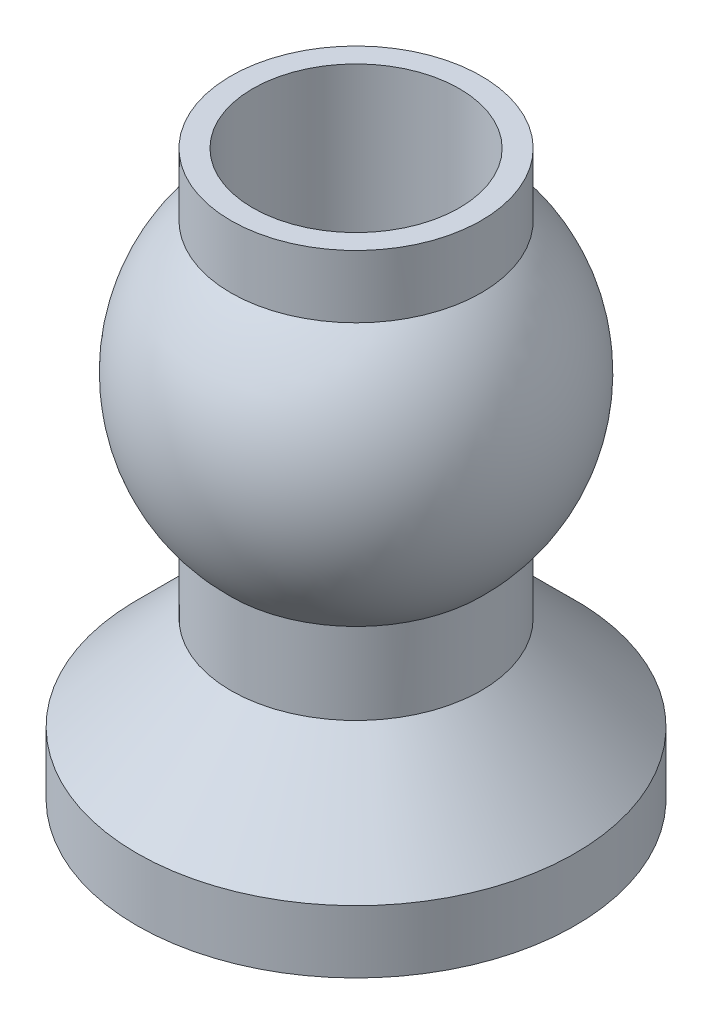
ISO-10303-21;
HEADER;
FILE_DESCRIPTION(('STEP AP214'),'2;1');
FILE_NAME('part.step','',(''),(''),'','','');
FILE_SCHEMA(('AUTOMOTIVE_DESIGN { 1 0 10303 214 1 1 1 1 }'));
ENDSEC;
DATA;
#1=APPLICATION_CONTEXT('core data for automotive mechanical design processes');
#2=APPLICATION_PROTOCOL_DEFINITION('international standard','automotive_design',2000,#1);
#3=PRODUCT_CONTEXT('',#1,'mechanical');
#4=PRODUCT('Part','Part','',(#3));
#5=PRODUCT_RELATED_PRODUCT_CATEGORY('part','',(#4));
#6=PRODUCT_DEFINITION_FORMATION('','',#4);
#7=PRODUCT_DEFINITION_CONTEXT('part definition',#1,'design');
#8=PRODUCT_DEFINITION('design','',#6,#7);
#9=PRODUCT_DEFINITION_SHAPE('','',#8);
#10=(LENGTH_UNIT() NAMED_UNIT(*) SI_UNIT(.MILLI.,.METRE.));
#11=(NAMED_UNIT(*) PLANE_ANGLE_UNIT() SI_UNIT($,.RADIAN.));
#12=(NAMED_UNIT(*) SI_UNIT($,.STERADIAN.) SOLID_ANGLE_UNIT());
#13=UNCERTAINTY_MEASURE_WITH_UNIT(LENGTH_MEASURE(1.E-05),#10,'distance_accuracy_value','');
#14=(GEOMETRIC_REPRESENTATION_CONTEXT(3) GLOBAL_UNCERTAINTY_ASSIGNED_CONTEXT((#13)) GLOBAL_UNIT_ASSIGNED_CONTEXT((#10,
#11,#12)) REPRESENTATION_CONTEXT('',''));
#15=CARTESIAN_POINT('',(0.,0.,0.));
#16=DIRECTION('',(0.,0.,1.));
#17=DIRECTION('',(1.,0.,0.));
#18=AXIS2_PLACEMENT_3D('',#15,#16,#17);
#19=CARTESIAN_POINT('',(2.,4.5,0.));
#20=DIRECTION('',(0.,-1.,0.));
#21=DIRECTION('',(0.,0.,-1.));
#22=AXIS2_PLACEMENT_3D('',#19,#20,#21);
#23=PLANE('',#22);
#24=CARTESIAN_POINT('',(0.,4.5,0.));
#25=DIRECTION('',(0.,1.,0.));
#26=DIRECTION('',(0.,0.,1.));
#27=AXIS2_PLACEMENT_3D('',#24,#25,#26);
#28=CIRCLE('',#27,1.65);
#29=CARTESIAN_POINT('',(0.,4.5,1.65));
#30=VERTEX_POINT('',#29);
#31=EDGE_CURVE('E56',#30,#30,#28,.T.);
#32=ORIENTED_EDGE('',*,*,#31,.F.);
#33=EDGE_LOOP('',(#32));
#34=FACE_BOUND('',#33,.T.);
#35=CARTESIAN_POINT('',(0.,4.5,0.));
#36=DIRECTION('',(0.,1.,0.));
#37=DIRECTION('',(0.,0.,1.));
#38=AXIS2_PLACEMENT_3D('',#35,#36,#37);
#39=CIRCLE('',#38,2.);
#40=CARTESIAN_POINT('',(0.,4.5,2.));
#41=VERTEX_POINT('',#40);
#42=EDGE_CURVE('E10',#41,#41,#39,.T.);
#43=ORIENTED_EDGE('',*,*,#42,.T.);
#44=EDGE_LOOP('',(#43));
#45=FACE_BOUND('',#44,.T.);
#46=ADVANCED_FACE('F31',(#34,#45),#23,.F.);
#47=CARTESIAN_POINT('',(0.,9.81662984616882,0.));
#48=DIRECTION('',(0.,1.,0.));
#49=DIRECTION('',(0.,0.,1.));
#50=AXIS2_PLACEMENT_3D('',#47,#48,#49);
#51=CYLINDRICAL_SURFACE('',#50,2.);
#52=ORIENTED_EDGE('',*,*,#42,.F.);
#53=EDGE_LOOP('',(#52));
#54=FACE_BOUND('',#53,.T.);
#55=CARTESIAN_POINT('',(0.,3.5,0.));
#56=DIRECTION('',(0.,1.,0.));
#57=DIRECTION('',(0.,0.,1.));
#58=AXIS2_PLACEMENT_3D('',#55,#56,#57);
#59=CIRCLE('',#58,2.);
#60=CARTESIAN_POINT('',(2.,3.5,0.));
#61=VERTEX_POINT('',#60);
#62=EDGE_CURVE('E38',#61,#61,#59,.T.);
#63=ORIENTED_EDGE('',*,*,#62,.T.);
#64=EDGE_LOOP('',(#63));
#65=FACE_BOUND('',#64,.T.);
#66=ADVANCED_FACE('F75',(#54,#65),#51,.T.);
#67=CARTESIAN_POINT('',(0.,1.4,0.));
#68=DIRECTION('',(0.,1.,0.));
#69=DIRECTION('',(1.,0.,0.));
#70=AXIS2_PLACEMENT_3D('',#67,#68,#69);
#71=SPHERICAL_SURFACE('',#70,2.9);
#72=CARTESIAN_POINT('',(0.,-0.700000000000001,0.));
#73=DIRECTION('',(0.,1.,0.));
#74=DIRECTION('',(0.,0.,1.));
#75=AXIS2_PLACEMENT_3D('',#72,#73,#74);
#76=CIRCLE('',#75,2.);
#77=CARTESIAN_POINT('',(2.,-0.700000000000001,0.));
#78=VERTEX_POINT('',#77);
#79=EDGE_CURVE('E42',#78,#78,#76,.T.);
#80=CARTESIAN_POINT('',(2.,3.5,0.));
#81=CARTESIAN_POINT('',(2.03542885615934,3.4662598029557,0.));
#82=CARTESIAN_POINT('',(2.070002258697,3.43162152430929,0.));
#83=CARTESIAN_POINT('',(2.13735324208609,3.36064095328789,0.));
#84=CARTESIAN_POINT('',(2.17013082293753,3.3242986609129,0.));
#85=CARTESIAN_POINT('',(2.23380524851134,3.25000221190998,0.));
#86=CARTESIAN_POINT('',(2.26470209323371,3.21204805528205,0.));
#87=CARTESIAN_POINT('',(2.32453618093648,3.13462532450518,0.));
#88=CARTESIAN_POINT('',(2.35347342391688,3.09515675035623,0.));
#89=CARTESIAN_POINT('',(2.40931413081567,3.0148061963374,0.));
#90=CARTESIAN_POINT('',(2.43621759473406,2.97392421646751,0.));
#91=CARTESIAN_POINT('',(2.48792186312119,2.89085156645577,0.));
#92=CARTESIAN_POINT('',(2.51272266758993,2.84866089631391,0.));
#93=CARTESIAN_POINT('',(2.56015809784021,2.7630789102345,0.));
#94=CARTESIAN_POINT('',(2.58279272362176,2.71968759429694,0.));
#95=CARTESIAN_POINT('',(2.62583783114081,2.63181544195321,0.));
#96=CARTESIAN_POINT('',(2.6462483128783,2.58733460554702,0.));
#97=CARTESIAN_POINT('',(2.68479286122644,2.49739732621215,0.));
#98=CARTESIAN_POINT('',(2.70292692783707,2.45194088328346,0.));
#99=CARTESIAN_POINT('',(2.73687220514585,2.36016880378588,0.));
#100=CARTESIAN_POINT('',(2.75268341584398,2.31385316721699,0.));
#101=CARTESIAN_POINT('',(2.78194248919463,2.22048131357834,0.));
#102=CARTESIAN_POINT('',(2.79539035184714,2.17342509650859,0.));
#103=CARTESIAN_POINT('',(2.81988828948024,2.0786925916464,0.));
#104=CARTESIAN_POINT('',(2.83093836446082,2.03101630385397,0.));
#105=CARTESIAN_POINT('',(2.85061242778805,1.93516575530158,0.));
#106=CARTESIAN_POINT('',(2.85923641613469,1.88699149454163,0.));
#107=CARTESIAN_POINT('',(2.87403622038034,1.79026837310766,0.));
#108=CARTESIAN_POINT('',(2.88021203627935,1.74171951243365,0.));
#109=CARTESIAN_POINT('',(2.89009967952264,1.64437152356526,0.));
#110=CARTESIAN_POINT('',(2.89381150686691,1.59557239537088,0.));
#111=CARTESIAN_POINT('',(2.89876166710559,1.49784884478433,0.));
#112=CARTESIAN_POINT('',(2.9,1.44892442239217,0.));
#113=CARTESIAN_POINT('',(2.9,1.35107557760783,0.));
#114=CARTESIAN_POINT('',(2.89876166710559,1.30215115521566,0.));
#115=CARTESIAN_POINT('',(2.89381150686691,1.20442760462912,0.));
#116=CARTESIAN_POINT('',(2.89009967952264,1.15562847643474,0.));
#117=CARTESIAN_POINT('',(2.88021203627935,1.05828048756635,0.));
#118=CARTESIAN_POINT('',(2.87403622038034,1.00973162689234,0.));
#119=CARTESIAN_POINT('',(2.85923641613469,0.913008505458373,0.));
#120=CARTESIAN_POINT('',(2.85061242778805,0.86483424469842,0.));
#121=CARTESIAN_POINT('',(2.83093836446082,0.768983696146033,0.));
#122=CARTESIAN_POINT('',(2.81988828948024,0.721307408353599,0.));
#123=CARTESIAN_POINT('',(2.79539035184714,0.62657490349141,0.));
#124=CARTESIAN_POINT('',(2.78194248919463,0.579518686421655,0.));
#125=CARTESIAN_POINT('',(2.75268341584398,0.486146832783009,0.));
#126=CARTESIAN_POINT('',(2.73687220514585,0.439831196214117,0.));
#127=CARTESIAN_POINT('',(2.70292692783707,0.348059116716537,0.));
#128=CARTESIAN_POINT('',(2.68479286122643,0.302602673787849,0.));
#129=CARTESIAN_POINT('',(2.6462483128783,0.212665394452976,0.));
#130=CARTESIAN_POINT('',(2.62583783114081,0.168184558046793,0.));
#131=CARTESIAN_POINT('',(2.58279272362176,0.0803124057030532,0.));
#132=CARTESIAN_POINT('',(2.56015809784021,0.0369210897654976,0.));
#133=CARTESIAN_POINT('',(2.51272266758993,-0.0486608963139133,0.));
#134=CARTESIAN_POINT('',(2.48792186312119,-0.0908515664557685,0.));
#135=CARTESIAN_POINT('',(2.43621759473406,-0.173924216467512,0.));
#136=CARTESIAN_POINT('',(2.40931413081567,-0.2148061963374,0.));
#137=CARTESIAN_POINT('',(2.35347342391688,-0.295156750356234,0.));
#138=CARTESIAN_POINT('',(2.32453618093648,-0.33462532450518,0.));
#139=CARTESIAN_POINT('',(2.26470209323371,-0.412048055282054,0.));
#140=CARTESIAN_POINT('',(2.23380524851134,-0.450002211909982,0.));
#141=CARTESIAN_POINT('',(2.17013082293753,-0.524298660912898,0.));
#142=CARTESIAN_POINT('',(2.13735324208609,-0.560640953287887,0.));
#143=CARTESIAN_POINT('',(2.070002258697,-0.631621524309287,0.));
#144=CARTESIAN_POINT('',(2.03542885615934,-0.666259802955698,0.));
#145=CARTESIAN_POINT('',(2.,-0.700000000000001,0.));
#146=B_SPLINE_CURVE_WITH_KNOTS('',3,(#80,#81,#82,#83,#84,#85,#86,#87,#88,#89,#90,#91,#92,#93,
#94,#95,#96,#97,#98,#99,#100,#101,#102,#103,#104,#105,#106,#107,#108,#109,#110,#111,#112,#113,
#114,#115,#116,#117,#118,#119,#120,#121,#122,#123,#124,#125,#126,#127,#128,#129,#130,#131,#132,
#133,#134,#135,#136,#137,#138,#139,#140,#141,#142,#143,#144,#145),.UNSPECIFIED.,.F.,.F.,(4,2,2,
2,2,2,2,2,2,2,2,2,2,2,2,2,2,2,2,2,2,2,2,2,2,2,2,2,2,2,2,2,4),(0.,0.14675760791103,
0.293515215822058,0.440272823733088,0.587030431644116,0.733788039555146,0.880545647466175,
1.0273032553772,1.17406086328823,1.32081847119926,1.46757607911029,1.61433368702132,
1.76109129493235,1.90784890284338,2.05460651075441,2.20136411866544,2.34812172657647,
2.49487933448749,2.64163694239852,2.78839455030955,2.93515215822058,3.08190976613161,
3.22866737404264,3.37542498195367,3.5221825898647,3.66894019777573,3.81569780568676,
3.96245541359778,4.10921302150881,4.25597062941984,4.40272823733087,4.5494858452419,
4.69624345315293),.UNSPECIFIED.);
#147=EDGE_CURVE('BSEAM80',#61,#78,#146,.T.);
#148=ORIENTED_EDGE('',*,*,#62,.F.);
#149=ORIENTED_EDGE('',*,*,#79,.T.);
#150=ORIENTED_EDGE('',*,*,#147,.T.);
#151=ORIENTED_EDGE('',*,*,#147,.F.);
#152=EDGE_LOOP('',(#148,#150,#149,#151));
#153=FACE_BOUND('',#152,.T.);
#154=ADVANCED_FACE('F80',(#153),#71,.T.);
#155=CARTESIAN_POINT('',(0.,9.81662984616882,0.));
#156=DIRECTION('',(0.,1.,0.));
#157=DIRECTION('',(0.,0.,1.));
#158=AXIS2_PLACEMENT_3D('',#155,#156,#157);
#159=CYLINDRICAL_SURFACE('',#158,2.);
#160=ORIENTED_EDGE('',*,*,#79,.F.);
#161=EDGE_LOOP('',(#160));
#162=FACE_BOUND('',#161,.T.);
#163=CARTESIAN_POINT('',(0.,-2.,0.));
#164=DIRECTION('',(0.,1.,0.));
#165=DIRECTION('',(0.,0.,1.));
#166=AXIS2_PLACEMENT_3D('',#163,#164,#165);
#167=CIRCLE('',#166,2.);
#168=CARTESIAN_POINT('',(0.,-2.,2.));
#169=VERTEX_POINT('',#168);
#170=EDGE_CURVE('E47',#169,#169,#167,.T.);
#171=ORIENTED_EDGE('',*,*,#170,.T.);
#172=EDGE_LOOP('',(#171));
#173=FACE_BOUND('',#172,.T.);
#174=ADVANCED_FACE('F85',(#162,#173),#159,.T.);
#175=CARTESIAN_POINT('',(0.,-3.5,0.));
#176=DIRECTION('',(0.,-1.,0.));
#177=DIRECTION('',(0.,0.,-1.));
#178=AXIS2_PLACEMENT_3D('',#175,#176,#177);
#179=CONICAL_SURFACE('',#178,3.5,0.785398163397449);
#180=ORIENTED_EDGE('',*,*,#170,.F.);
#181=EDGE_LOOP('',(#180));
#182=FACE_BOUND('',#181,.T.);
#183=CARTESIAN_POINT('',(0.,-3.5,0.));
#184=DIRECTION('',(0.,1.,0.));
#185=DIRECTION('',(0.,0.,1.));
#186=AXIS2_PLACEMENT_3D('',#183,#184,#185);
#187=CIRCLE('',#186,3.5);
#188=CARTESIAN_POINT('',(0.,-3.5,3.5));
#189=VERTEX_POINT('',#188);
#190=EDGE_CURVE('E50',#189,#189,#187,.T.);
#191=ORIENTED_EDGE('',*,*,#190,.T.);
#192=EDGE_LOOP('',(#191));
#193=FACE_BOUND('',#192,.T.);
#194=ADVANCED_FACE('F92',(#182,#193),#179,.T.);
#195=CARTESIAN_POINT('',(0.,9.81662984616882,0.));
#196=DIRECTION('',(0.,1.,0.));
#197=DIRECTION('',(0.,0.,1.));
#198=AXIS2_PLACEMENT_3D('',#195,#196,#197);
#199=CYLINDRICAL_SURFACE('',#198,3.5);
#200=ORIENTED_EDGE('',*,*,#190,.F.);
#201=EDGE_LOOP('',(#200));
#202=FACE_BOUND('',#201,.T.);
#203=CARTESIAN_POINT('',(0.,-4.5,0.));
#204=DIRECTION('',(0.,1.,0.));
#205=DIRECTION('',(0.,0.,1.));
#206=AXIS2_PLACEMENT_3D('',#203,#204,#205);
#207=CIRCLE('',#206,3.5);
#208=CARTESIAN_POINT('',(0.,-4.5,3.5));
#209=VERTEX_POINT('',#208);
#210=EDGE_CURVE('E53',#209,#209,#207,.T.);
#211=ORIENTED_EDGE('',*,*,#210,.T.);
#212=EDGE_LOOP('',(#211));
#213=FACE_BOUND('',#212,.T.);
#214=ADVANCED_FACE('F72',(#202,#213),#199,.T.);
#215=CARTESIAN_POINT('',(0.,-4.5,0.));
#216=DIRECTION('',(0.,1.,0.));
#217=DIRECTION('',(0.,0.,1.));
#218=AXIS2_PLACEMENT_3D('',#215,#216,#217);
#219=PLANE('',#218);
#220=CARTESIAN_POINT('',(0.,-4.5,0.));
#221=DIRECTION('',(0.,1.,0.));
#222=DIRECTION('',(0.,0.,1.));
#223=AXIS2_PLACEMENT_3D('',#220,#221,#222);
#224=CIRCLE('',#223,1.65);
#225=CARTESIAN_POINT('',(0.,-4.5,1.65));
#226=VERTEX_POINT('',#225);
#227=EDGE_CURVE('E34',#226,#226,#224,.T.);
#228=ORIENTED_EDGE('',*,*,#227,.T.);
#229=EDGE_LOOP('',(#228));
#230=FACE_BOUND('',#229,.T.);
#231=ORIENTED_EDGE('',*,*,#210,.F.);
#232=EDGE_LOOP('',(#231));
#233=FACE_BOUND('',#232,.T.);
#234=ADVANCED_FACE('F63',(#230,#233),#219,.F.);
#235=CARTESIAN_POINT('',(0.,-8.,0.));
#236=DIRECTION('',(0.,1.,0.));
#237=DIRECTION('',(0.,0.,1.));
#238=AXIS2_PLACEMENT_3D('',#235,#236,#237);
#239=CYLINDRICAL_SURFACE('',#238,1.65);
#240=ORIENTED_EDGE('',*,*,#31,.T.);
#241=EDGE_LOOP('',(#240));
#242=FACE_BOUND('',#241,.T.);
#243=ORIENTED_EDGE('',*,*,#227,.F.);
#244=EDGE_LOOP('',(#243));
#245=FACE_BOUND('',#244,.T.);
#246=ADVANCED_FACE('F66',(#242,#245),#239,.F.);
#247=CLOSED_SHELL('',(#46,#66,#154,#174,#194,#214,#234,#246));
#248=MANIFOLD_SOLID_BREP('B2',#247);
#249=ADVANCED_BREP_SHAPE_REPRESENTATION('',(#18,#248),#14);
#250=SHAPE_DEFINITION_REPRESENTATION(#9,#249);
ENDSEC;
END-ISO-10303-21;
